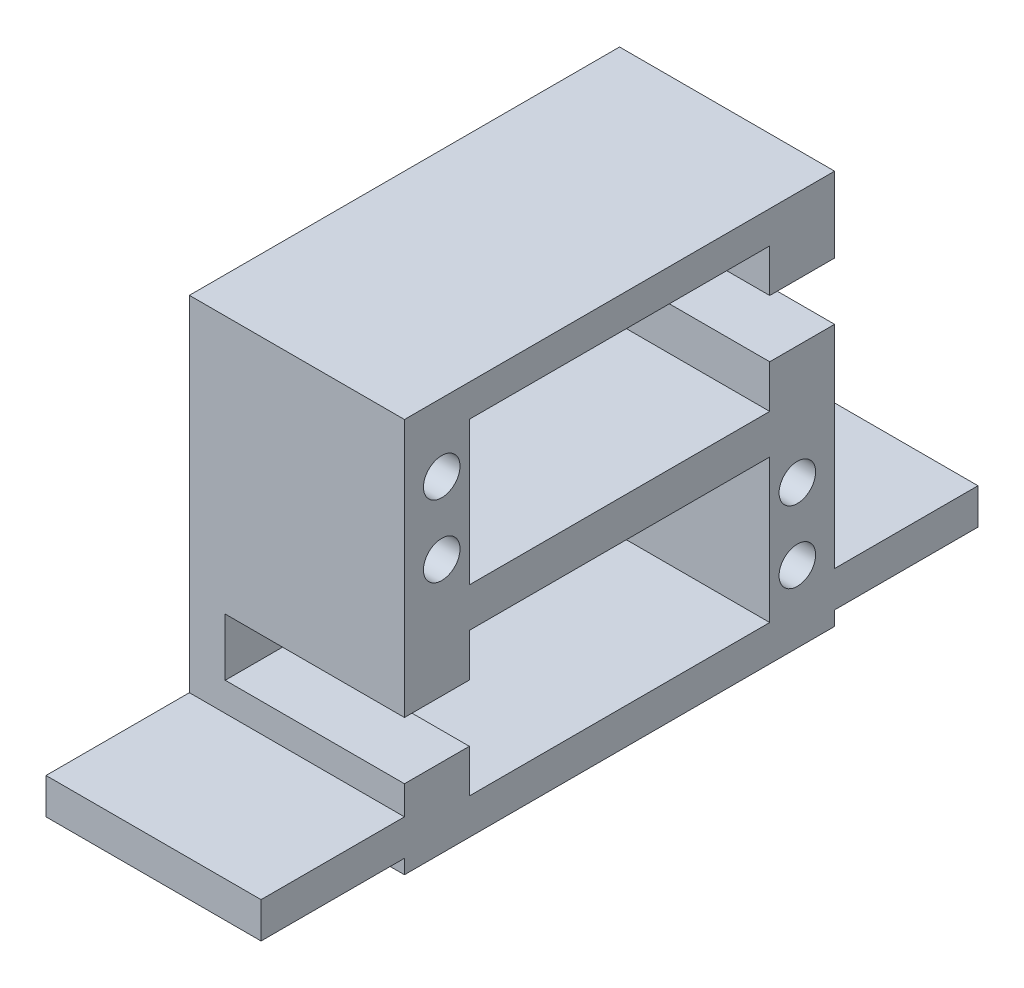
ISO-10303-21;
HEADER;
FILE_DESCRIPTION(('STEP AP214'),'2;1');
FILE_NAME('part.step','',(''),(''),'','','');
FILE_SCHEMA(('AUTOMOTIVE_DESIGN { 1 0 10303 214 1 1 1 1 }'));
ENDSEC;
DATA;
#1=APPLICATION_CONTEXT('core data for automotive mechanical design processes');
#2=APPLICATION_PROTOCOL_DEFINITION('international standard','automotive_design',2000,#1);
#3=PRODUCT_CONTEXT('',#1,'mechanical');
#4=PRODUCT('Part','Part','',(#3));
#5=PRODUCT_RELATED_PRODUCT_CATEGORY('part','',(#4));
#6=PRODUCT_DEFINITION_FORMATION('','',#4);
#7=PRODUCT_DEFINITION_CONTEXT('part definition',#1,'design');
#8=PRODUCT_DEFINITION('design','',#6,#7);
#9=PRODUCT_DEFINITION_SHAPE('','',#8);
#10=(LENGTH_UNIT() NAMED_UNIT(*) SI_UNIT(.MILLI.,.METRE.));
#11=(NAMED_UNIT(*) PLANE_ANGLE_UNIT() SI_UNIT($,.RADIAN.));
#12=(NAMED_UNIT(*) SI_UNIT($,.STERADIAN.) SOLID_ANGLE_UNIT());
#13=UNCERTAINTY_MEASURE_WITH_UNIT(LENGTH_MEASURE(1.E-05),#10,'distance_accuracy_value','');
#14=(GEOMETRIC_REPRESENTATION_CONTEXT(3) GLOBAL_UNCERTAINTY_ASSIGNED_CONTEXT((#13)) GLOBAL_UNIT_ASSIGNED_CONTEXT((#10,
#11,#12)) REPRESENTATION_CONTEXT('',''));
#15=CARTESIAN_POINT('',(0.,0.,0.));
#16=DIRECTION('',(0.,0.,1.));
#17=DIRECTION('',(1.,0.,0.));
#18=AXIS2_PLACEMENT_3D('',#15,#16,#17);
#19=CARTESIAN_POINT('',(4.12598425196847,25.,13.5877952755906));
#20=DIRECTION('',(0.,0.,1.));
#21=DIRECTION('',(0.,-1.,0.));
#22=AXIS2_PLACEMENT_3D('',#19,#20,#21);
#23=PLANE('',#22);
#24=DIRECTION('',(-1.,0.,0.));
#25=VECTOR('',#24,1.);
#26=CARTESIAN_POINT('',(29.1259842519685,5.,13.5877952755906));
#27=LINE('',#26,#25);
#28=CARTESIAN_POINT('',(29.1259842519685,5.,13.5877952755906));
#29=VERTEX_POINT('',#28);
#30=CARTESIAN_POINT('',(4.12598425196847,5.,13.5877952755906));
#31=VERTEX_POINT('',#30);
#32=EDGE_CURVE('E69',#29,#31,#27,.T.);
#33=ORIENTED_EDGE('',*,*,#32,.T.);
#34=DIRECTION('',(0.,-1.,0.));
#35=VECTOR('',#34,1.);
#36=CARTESIAN_POINT('',(4.12598425196847,25.,13.5877952755906));
#37=LINE('',#36,#35);
#38=CARTESIAN_POINT('',(4.12598425196847,11.,13.5877952755906));
#39=VERTEX_POINT('',#38);
#40=EDGE_CURVE('E475',#39,#31,#37,.T.);
#41=ORIENTED_EDGE('',*,*,#40,.F.);
#42=DIRECTION('',(1.,0.,0.));
#43=VECTOR('',#42,1.);
#44=CARTESIAN_POINT('',(4.12598425196847,11.,13.5877952755906));
#45=LINE('',#44,#43);
#46=CARTESIAN_POINT('',(29.1259842519685,11.,13.5877952755906));
#47=VERTEX_POINT('',#46);
#48=EDGE_CURVE('E395',#39,#47,#45,.T.);
#49=ORIENTED_EDGE('',*,*,#48,.T.);
#50=DIRECTION('',(0.,1.,0.));
#51=VECTOR('',#50,1.);
#52=CARTESIAN_POINT('',(29.1259842519685,25.,13.5877952755906));
#53=LINE('',#52,#51);
#54=EDGE_CURVE('E335',#29,#47,#53,.T.);
#55=ORIENTED_EDGE('',*,*,#54,.F.);
#56=EDGE_LOOP('',(#33,#41,#49,#55));
#57=FACE_BOUND('',#56,.T.);
#58=ADVANCED_FACE('F45',(#57),#23,.F.);
#59=CARTESIAN_POINT('',(4.12598425196847,25.,-28.3122047244094));
#60=DIRECTION('',(0.,0.,-1.));
#61=DIRECTION('',(-1.,0.,0.));
#62=AXIS2_PLACEMENT_3D('',#59,#60,#61);
#63=PLANE('',#62);
#64=DIRECTION('',(-1.,0.,0.));
#65=VECTOR('',#64,1.);
#66=CARTESIAN_POINT('',(29.1259842519685,5.,-28.3122047244094));
#67=LINE('',#66,#65);
#68=CARTESIAN_POINT('',(29.1259842519685,5.,-28.3122047244094));
#69=VERTEX_POINT('',#68);
#70=CARTESIAN_POINT('',(4.12598425196847,5.,-28.3122047244094));
#71=VERTEX_POINT('',#70);
#72=EDGE_CURVE('E559',#69,#71,#67,.T.);
#73=ORIENTED_EDGE('',*,*,#72,.F.);
#74=DIRECTION('',(0.,-1.,0.));
#75=VECTOR('',#74,1.);
#76=CARTESIAN_POINT('',(29.1259842519685,25.,-28.3122047244094));
#77=LINE('',#76,#75);
#78=CARTESIAN_POINT('',(29.1259842519685,25.,-28.3122047244094));
#79=VERTEX_POINT('',#78);
#80=EDGE_CURVE('E338',#79,#69,#77,.T.);
#81=ORIENTED_EDGE('',*,*,#80,.F.);
#82=DIRECTION('',(1.,0.,0.));
#83=VECTOR('',#82,1.);
#84=CARTESIAN_POINT('',(4.12598425196847,25.,-28.3122047244094));
#85=LINE('',#84,#83);
#86=CARTESIAN_POINT('',(4.12598425196847,25.,-28.3122047244094));
#87=VERTEX_POINT('',#86);
#88=EDGE_CURVE('E461',#87,#79,#85,.T.);
#89=ORIENTED_EDGE('',*,*,#88,.F.);
#90=DIRECTION('',(0.,1.,0.));
#91=VECTOR('',#90,1.);
#92=CARTESIAN_POINT('',(4.12598425196847,25.,-28.3122047244094));
#93=LINE('',#92,#91);
#94=EDGE_CURVE('E472',#71,#87,#93,.T.);
#95=ORIENTED_EDGE('',*,*,#94,.F.);
#96=EDGE_LOOP('',(#73,#81,#89,#95));
#97=FACE_BOUND('',#96,.T.);
#98=ADVANCED_FACE('F557',(#97),#63,.F.);
#99=CARTESIAN_POINT('',(4.12598425196847,0.,0.));
#100=DIRECTION('',(1.,0.,0.));
#101=DIRECTION('',(0.,0.,-1.));
#102=AXIS2_PLACEMENT_3D('',#99,#100,#101);
#103=PLANE('',#102);
#104=ORIENTED_EDGE('',*,*,#40,.T.);
#105=DIRECTION('',(0.,0.,1.));
#106=VECTOR('',#105,1.);
#107=CARTESIAN_POINT('',(4.12598425196847,5.,13.5877952755906));
#108=LINE('',#107,#106);
#109=EDGE_CURVE('E61',#71,#31,#108,.T.);
#110=ORIENTED_EDGE('',*,*,#109,.F.);
#111=ORIENTED_EDGE('',*,*,#94,.T.);
#112=DIRECTION('',(0.,0.,1.));
#113=VECTOR('',#112,1.);
#114=CARTESIAN_POINT('',(4.12598425196847,25.,13.5877952755906));
#115=LINE('',#114,#113);
#116=CARTESIAN_POINT('',(4.12598425196847,25.,13.5877952755906));
#117=VERTEX_POINT('',#116);
#118=EDGE_CURVE('E465',#87,#117,#115,.T.);
#119=ORIENTED_EDGE('',*,*,#118,.T.);
#120=CARTESIAN_POINT('',(4.12598425196847,19.,13.5877952755906));
#121=VERTEX_POINT('',#120);
#122=EDGE_CURVE('E431',#117,#121,#37,.T.);
#123=ORIENTED_EDGE('',*,*,#122,.T.);
#124=DIRECTION('',(0.,0.,1.));
#125=VECTOR('',#124,1.);
#126=CARTESIAN_POINT('',(4.12598425196847,19.,22.6377952755906));
#127=LINE('',#126,#125);
#128=CARTESIAN_POINT('',(4.12598425196847,19.,22.6377952755906));
#129=VERTEX_POINT('',#128);
#130=EDGE_CURVE('E381',#121,#129,#127,.T.);
#131=ORIENTED_EDGE('',*,*,#130,.T.);
#132=DIRECTION('',(0.,-1.,0.));
#133=VECTOR('',#132,1.);
#134=CARTESIAN_POINT('',(4.12598425196847,19.,22.6377952755906));
#135=LINE('',#134,#133);
#136=CARTESIAN_POINT('',(4.12598425196847,11.,22.6377952755906));
#137=VERTEX_POINT('',#136);
#138=EDGE_CURVE('E373',#129,#137,#135,.T.);
#139=ORIENTED_EDGE('',*,*,#138,.T.);
#140=DIRECTION('',(0.,0.,-1.));
#141=VECTOR('',#140,1.);
#142=CARTESIAN_POINT('',(4.12598425196847,11.,22.6377952755906));
#143=LINE('',#142,#141);
#144=EDGE_CURVE('E377',#137,#39,#143,.T.);
#145=ORIENTED_EDGE('',*,*,#144,.T.);
#146=EDGE_LOOP('',(#104,#110,#111,#119,#123,#131,#139,#145));
#147=FACE_BOUND('',#146,.T.);
#148=ADVANCED_FACE('F539',(#147),#103,.T.);
#149=CARTESIAN_POINT('',(-0.874015748031524,55.,22.6377952755906));
#150=DIRECTION('',(0.,0.,-1.));
#151=DIRECTION('',(-1.,0.,0.));
#152=AXIS2_PLACEMENT_3D('',#149,#150,#151);
#153=PLANE('',#152);
#154=DIRECTION('',(0.,-1.,0.));
#155=VECTOR('',#154,1.);
#156=CARTESIAN_POINT('',(-0.874015748031524,55.,22.6377952755906));
#157=LINE('',#156,#155);
#158=CARTESIAN_POINT('',(-0.874015748031524,55.,22.6377952755906));
#159=VERTEX_POINT('',#158);
#160=CARTESIAN_POINT('',(-0.874015748031524,7.,22.6377952755906));
#161=VERTEX_POINT('',#160);
#162=EDGE_CURVE('E54',#159,#161,#157,.T.);
#163=ORIENTED_EDGE('',*,*,#162,.T.);
#164=DIRECTION('',(1.,0.,0.));
#165=VECTOR('',#164,1.);
#166=CARTESIAN_POINT('',(-0.874015748031524,7.,22.6377952755906));
#167=LINE('',#166,#165);
#168=CARTESIAN_POINT('',(29.1259842519685,7.,22.6377952755906));
#169=VERTEX_POINT('',#168);
#170=EDGE_CURVE('E314',#161,#169,#167,.T.);
#171=ORIENTED_EDGE('',*,*,#170,.T.);
#172=DIRECTION('',(0.,-1.,0.));
#173=VECTOR('',#172,1.);
#174=CARTESIAN_POINT('',(29.1259842519685,55.,22.6377952755906));
#175=LINE('',#174,#173);
#176=CARTESIAN_POINT('',(29.1259842519685,11.,22.6377952755906));
#177=VERTEX_POINT('',#176);
#178=EDGE_CURVE('E323',#177,#169,#175,.T.);
#179=ORIENTED_EDGE('',*,*,#178,.F.);
#180=DIRECTION('',(1.,0.,0.));
#181=VECTOR('',#180,1.);
#182=CARTESIAN_POINT('',(4.12598425196847,11.,22.6377952755906));
#183=LINE('',#182,#181);
#184=EDGE_CURVE('E385',#137,#177,#183,.T.);
#185=ORIENTED_EDGE('',*,*,#184,.F.);
#186=ORIENTED_EDGE('',*,*,#138,.F.);
#187=DIRECTION('',(1.,0.,0.));
#188=VECTOR('',#187,1.);
#189=CARTESIAN_POINT('',(4.12598425196847,19.,22.6377952755906));
#190=LINE('',#189,#188);
#191=CARTESIAN_POINT('',(29.1259842519685,19.,22.6377952755906));
#192=VERTEX_POINT('',#191);
#193=EDGE_CURVE('E386',#129,#192,#190,.T.);
#194=ORIENTED_EDGE('',*,*,#193,.T.);
#195=CARTESIAN_POINT('',(29.1259842519685,55.,22.6377952755906));
#196=VERTEX_POINT('',#195);
#197=EDGE_CURVE('E319',#196,#192,#175,.T.);
#198=ORIENTED_EDGE('',*,*,#197,.F.);
#199=DIRECTION('',(1.,0.,0.));
#200=VECTOR('',#199,1.);
#201=CARTESIAN_POINT('',(-0.874015748031524,55.,22.6377952755906));
#202=LINE('',#201,#200);
#203=EDGE_CURVE('E483',#159,#196,#202,.T.);
#204=ORIENTED_EDGE('',*,*,#203,.F.);
#205=EDGE_LOOP('',(#163,#171,#179,#185,#186,#194,#198,#204));
#206=FACE_BOUND('',#205,.T.);
#207=ADVANCED_FACE('F534',(#206),#153,.F.);
#208=CARTESIAN_POINT('',(-0.874015748031532,55.,-37.3622047244094));
#209=DIRECTION('',(0.,0.,1.));
#210=DIRECTION('',(1.,0.,0.));
#211=AXIS2_PLACEMENT_3D('',#208,#209,#210);
#212=PLANE('',#211);
#213=DIRECTION('',(0.,1.,0.));
#214=VECTOR('',#213,1.);
#215=CARTESIAN_POINT('',(29.1259842519685,55.,-37.3622047244094));
#216=LINE('',#215,#214);
#217=CARTESIAN_POINT('',(29.1259842519685,7.,-37.3622047244094));
#218=VERTEX_POINT('',#217);
#219=CARTESIAN_POINT('',(29.1259842519685,36.5,-37.3622047244094));
#220=VERTEX_POINT('',#219);
#221=EDGE_CURVE('E332',#218,#220,#216,.T.);
#222=ORIENTED_EDGE('',*,*,#221,.F.);
#223=DIRECTION('',(-1.,0.,0.));
#224=VECTOR('',#223,1.);
#225=CARTESIAN_POINT('',(-0.874015748031532,7.,-37.3622047244094));
#226=LINE('',#225,#224);
#227=CARTESIAN_POINT('',(-0.874015748031524,7.,-37.3622047244094));
#228=VERTEX_POINT('',#227);
#229=EDGE_CURVE('E310',#218,#228,#226,.T.);
#230=ORIENTED_EDGE('',*,*,#229,.T.);
#231=DIRECTION('',(0.,-1.,0.));
#232=VECTOR('',#231,1.);
#233=CARTESIAN_POINT('',(-0.874015748031532,55.,-37.3622047244094));
#234=LINE('',#233,#232);
#235=CARTESIAN_POINT('',(-0.874015748031532,55.,-37.3622047244094));
#236=VERTEX_POINT('',#235);
#237=EDGE_CURVE('E501',#236,#228,#234,.T.);
#238=ORIENTED_EDGE('',*,*,#237,.F.);
#239=DIRECTION('',(-1.,0.,0.));
#240=VECTOR('',#239,1.);
#241=CARTESIAN_POINT('',(-0.874015748031532,55.,-37.3622047244094));
#242=LINE('',#241,#240);
#243=CARTESIAN_POINT('',(29.1259842519685,55.,-37.3622047244094));
#244=VERTEX_POINT('',#243);
#245=EDGE_CURVE('E488',#244,#236,#242,.T.);
#246=ORIENTED_EDGE('',*,*,#245,.F.);
#247=CARTESIAN_POINT('',(29.1259842519685,44.5,-37.3622047244094));
#248=VERTEX_POINT('',#247);
#249=EDGE_CURVE('E326',#248,#244,#216,.T.);
#250=ORIENTED_EDGE('',*,*,#249,.F.);
#251=DIRECTION('',(1.,0.,0.));
#252=VECTOR('',#251,1.);
#253=CARTESIAN_POINT('',(4.12598425196847,44.5,-37.3622047244094));
#254=LINE('',#253,#252);
#255=CARTESIAN_POINT('',(4.12598425196847,44.5,-37.3622047244094));
#256=VERTEX_POINT('',#255);
#257=EDGE_CURVE('E411',#256,#248,#254,.T.);
#258=ORIENTED_EDGE('',*,*,#257,.F.);
#259=DIRECTION('',(0.,1.,0.));
#260=VECTOR('',#259,1.);
#261=CARTESIAN_POINT('',(4.12598425196847,44.5,-37.3622047244094));
#262=LINE('',#261,#260);
#263=CARTESIAN_POINT('',(4.12598425196847,36.5,-37.3622047244094));
#264=VERTEX_POINT('',#263);
#265=EDGE_CURVE('E420',#264,#256,#262,.T.);
#266=ORIENTED_EDGE('',*,*,#265,.F.);
#267=DIRECTION('',(1.,0.,0.));
#268=VECTOR('',#267,1.);
#269=CARTESIAN_POINT('',(4.12598425196847,36.5,-37.3622047244094));
#270=LINE('',#269,#268);
#271=EDGE_CURVE('E407',#264,#220,#270,.T.);
#272=ORIENTED_EDGE('',*,*,#271,.T.);
#273=EDGE_LOOP('',(#222,#230,#238,#246,#250,#258,#266,#272));
#274=FACE_BOUND('',#273,.T.);
#275=ADVANCED_FACE('F618',(#274),#212,.F.);
#276=DIRECTION('',(0.,1.,0.));
#277=VECTOR('',#276,1.);
#278=CARTESIAN_POINT('',(29.1259842519685,25.,13.5877952755906));
#279=LINE('',#278,#277);
#280=CARTESIAN_POINT('',(29.1259842519685,19.,13.5877952755906));
#281=VERTEX_POINT('',#280);
#282=CARTESIAN_POINT('',(29.1259842519685,25.,13.5877952755906));
#283=VERTEX_POINT('',#282);
#284=EDGE_CURVE('E345',#281,#283,#279,.T.);
#285=ORIENTED_EDGE('',*,*,#284,.F.);
#286=DIRECTION('',(1.,0.,0.));
#287=VECTOR('',#286,1.);
#288=CARTESIAN_POINT('',(4.12598425196847,19.,13.5877952755906));
#289=LINE('',#288,#287);
#290=EDGE_CURVE('E391',#121,#281,#289,.T.);
#291=ORIENTED_EDGE('',*,*,#290,.F.);
#292=ORIENTED_EDGE('',*,*,#122,.F.);
#293=DIRECTION('',(1.,0.,0.));
#294=VECTOR('',#293,1.);
#295=CARTESIAN_POINT('',(4.12598425196847,25.,13.5877952755906));
#296=LINE('',#295,#294);
#297=EDGE_CURVE('E390',#117,#283,#296,.T.);
#298=ORIENTED_EDGE('',*,*,#297,.T.);
#299=EDGE_LOOP('',(#285,#291,#292,#298));
#300=FACE_BOUND('',#299,.T.);
#301=ADVANCED_FACE('F548',(#300),#23,.F.);
#302=CARTESIAN_POINT('',(4.12598425196847,50.5,-28.3122047244094));
#303=DIRECTION('',(0.,0.,-1.));
#304=DIRECTION('',(-1.,0.,0.));
#305=AXIS2_PLACEMENT_3D('',#302,#303,#304);
#306=PLANE('',#305);
#307=DIRECTION('',(0.,-1.,0.));
#308=VECTOR('',#307,1.);
#309=CARTESIAN_POINT('',(29.1259842519685,50.5,-28.3122047244094));
#310=LINE('',#309,#308);
#311=CARTESIAN_POINT('',(29.1259842519685,50.5,-28.3122047244094));
#312=VERTEX_POINT('',#311);
#313=CARTESIAN_POINT('',(29.1259842519685,44.5,-28.3122047244094));
#314=VERTEX_POINT('',#313);
#315=EDGE_CURVE('E366',#312,#314,#310,.T.);
#316=ORIENTED_EDGE('',*,*,#315,.F.);
#317=DIRECTION('',(1.,0.,0.));
#318=VECTOR('',#317,1.);
#319=CARTESIAN_POINT('',(4.12598425196847,50.5,-28.3122047244094));
#320=LINE('',#319,#318);
#321=CARTESIAN_POINT('',(4.12598425196847,50.5,-28.3122047244094));
#322=VERTEX_POINT('',#321);
#323=EDGE_CURVE('E450',#322,#312,#320,.T.);
#324=ORIENTED_EDGE('',*,*,#323,.F.);
#325=DIRECTION('',(0.,1.,0.));
#326=VECTOR('',#325,1.);
#327=CARTESIAN_POINT('',(4.12598425196847,50.5,-28.3122047244094));
#328=LINE('',#327,#326);
#329=CARTESIAN_POINT('',(4.12598425196847,44.5,-28.3122047244094));
#330=VERTEX_POINT('',#329);
#331=EDGE_CURVE('E435',#330,#322,#328,.T.);
#332=ORIENTED_EDGE('',*,*,#331,.F.);
#333=DIRECTION('',(1.,0.,0.));
#334=VECTOR('',#333,1.);
#335=CARTESIAN_POINT('',(4.12598425196847,44.5,-28.3122047244094));
#336=LINE('',#335,#334);
#337=EDGE_CURVE('E372',#330,#314,#336,.T.);
#338=ORIENTED_EDGE('',*,*,#337,.T.);
#339=EDGE_LOOP('',(#316,#324,#332,#338));
#340=FACE_BOUND('',#339,.T.);
#341=ADVANCED_FACE('F617',(#340),#306,.F.);
#342=CARTESIAN_POINT('',(29.1259842519685,2.,22.6377952755906));
#343=VERTEX_POINT('',#342);
#344=CARTESIAN_POINT('',(29.1259842519685,0.,22.6377952755906));
#345=VERTEX_POINT('',#344);
#346=EDGE_CURVE('E318',#343,#345,#175,.T.);
#347=ORIENTED_EDGE('',*,*,#346,.F.);
#348=DIRECTION('',(-1.,0.,0.));
#349=VECTOR('',#348,1.);
#350=CARTESIAN_POINT('',(-0.874015748031524,2.,22.6377952755906));
#351=LINE('',#350,#349);
#352=CARTESIAN_POINT('',(-0.874015748031524,2.,22.6377952755906));
#353=VERTEX_POINT('',#352);
#354=EDGE_CURVE('E307',#343,#353,#351,.T.);
#355=ORIENTED_EDGE('',*,*,#354,.T.);
#356=CARTESIAN_POINT('',(-0.874015748031524,0.,22.6377952755906));
#357=VERTEX_POINT('',#356);
#358=EDGE_CURVE('E237',#353,#357,#157,.T.);
#359=ORIENTED_EDGE('',*,*,#358,.T.);
#360=DIRECTION('',(1.,0.,0.));
#361=VECTOR('',#360,1.);
#362=CARTESIAN_POINT('',(-0.874015748031524,0.,22.6377952755906));
#363=LINE('',#362,#361);
#364=EDGE_CURVE('E494',#357,#345,#363,.T.);
#365=ORIENTED_EDGE('',*,*,#364,.T.);
#366=EDGE_LOOP('',(#347,#355,#359,#365));
#367=FACE_BOUND('',#366,.T.);
#368=ADVANCED_FACE('F512',(#367),#153,.F.);
#369=CARTESIAN_POINT('',(-0.874015748031524,2.,-37.3622047244094));
#370=VERTEX_POINT('',#369);
#371=CARTESIAN_POINT('',(-0.874015748031532,0.,-37.3622047244094));
#372=VERTEX_POINT('',#371);
#373=EDGE_CURVE('E491',#370,#372,#234,.T.);
#374=ORIENTED_EDGE('',*,*,#373,.F.);
#375=DIRECTION('',(1.,0.,0.));
#376=VECTOR('',#375,1.);
#377=CARTESIAN_POINT('',(-0.874015748031532,2.,-37.3622047244094));
#378=LINE('',#377,#376);
#379=CARTESIAN_POINT('',(29.1259842519685,2.,-37.3622047244094));
#380=VERTEX_POINT('',#379);
#381=EDGE_CURVE('E292',#370,#380,#378,.T.);
#382=ORIENTED_EDGE('',*,*,#381,.T.);
#383=CARTESIAN_POINT('',(29.1259842519685,0.,-37.3622047244094));
#384=VERTEX_POINT('',#383);
#385=EDGE_CURVE('E327',#384,#380,#216,.T.);
#386=ORIENTED_EDGE('',*,*,#385,.F.);
#387=DIRECTION('',(-1.,0.,0.));
#388=VECTOR('',#387,1.);
#389=CARTESIAN_POINT('',(-0.874015748031532,0.,-37.3622047244094));
#390=LINE('',#389,#388);
#391=EDGE_CURVE('E484',#384,#372,#390,.T.);
#392=ORIENTED_EDGE('',*,*,#391,.T.);
#393=EDGE_LOOP('',(#374,#382,#386,#392));
#394=FACE_BOUND('',#393,.T.);
#395=ADVANCED_FACE('F522',(#394),#212,.F.);
#396=CARTESIAN_POINT('',(0.,55.,0.));
#397=DIRECTION('',(0.,1.,0.));
#398=DIRECTION('',(0.,0.,1.));
#399=AXIS2_PLACEMENT_3D('',#396,#397,#398);
#400=PLANE('',#399);
#401=ORIENTED_EDGE('',*,*,#203,.T.);
#402=DIRECTION('',(0.,0.,1.));
#403=VECTOR('',#402,1.);
#404=CARTESIAN_POINT('',(29.1259842519685,55.,22.6377952755906));
#405=LINE('',#404,#403);
#406=EDGE_CURVE('E331',#244,#196,#405,.T.);
#407=ORIENTED_EDGE('',*,*,#406,.F.);
#408=ORIENTED_EDGE('',*,*,#245,.T.);
#409=DIRECTION('',(0.,0.,1.));
#410=VECTOR('',#409,1.);
#411=CARTESIAN_POINT('',(-0.874015748031532,55.,-37.3622047244094));
#412=LINE('',#411,#410);
#413=EDGE_CURVE('E479',#236,#159,#412,.T.);
#414=ORIENTED_EDGE('',*,*,#413,.T.);
#415=EDGE_LOOP('',(#401,#407,#408,#414));
#416=FACE_BOUND('',#415,.T.);
#417=ADVANCED_FACE('F636',(#416),#400,.T.);
#418=CARTESIAN_POINT('',(0.,0.,0.));
#419=DIRECTION('',(0.,1.,0.));
#420=DIRECTION('',(0.,0.,1.));
#421=AXIS2_PLACEMENT_3D('',#418,#419,#420);
#422=PLANE('',#421);
#423=DIRECTION('',(0.,0.,-1.));
#424=VECTOR('',#423,1.);
#425=CARTESIAN_POINT('',(29.1259842519685,0.,22.6377952755906));
#426=LINE('',#425,#424);
#427=EDGE_CURVE('E322',#345,#384,#426,.T.);
#428=ORIENTED_EDGE('',*,*,#427,.F.);
#429=ORIENTED_EDGE('',*,*,#364,.F.);
#430=DIRECTION('',(0.,0.,1.));
#431=VECTOR('',#430,1.);
#432=CARTESIAN_POINT('',(-0.874015748031532,0.,-37.3622047244094));
#433=LINE('',#432,#431);
#434=EDGE_CURVE('E449',#372,#357,#433,.T.);
#435=ORIENTED_EDGE('',*,*,#434,.F.);
#436=ORIENTED_EDGE('',*,*,#391,.F.);
#437=EDGE_LOOP('',(#428,#429,#435,#436));
#438=FACE_BOUND('',#437,.T.);
#439=ADVANCED_FACE('F516',(#438),#422,.F.);
#440=CARTESIAN_POINT('',(4.12598425196847,25.,13.5877952755906));
#441=DIRECTION('',(0.,1.,0.));
#442=DIRECTION('',(0.,0.,1.));
#443=AXIS2_PLACEMENT_3D('',#440,#441,#442);
#444=PLANE('',#443);
#445=DIRECTION('',(0.,0.,-1.));
#446=VECTOR('',#445,1.);
#447=CARTESIAN_POINT('',(29.1259842519685,25.,13.5877952755906));
#448=LINE('',#447,#446);
#449=EDGE_CURVE('E342',#283,#79,#448,.T.);
#450=ORIENTED_EDGE('',*,*,#449,.F.);
#451=ORIENTED_EDGE('',*,*,#297,.F.);
#452=ORIENTED_EDGE('',*,*,#118,.F.);
#453=ORIENTED_EDGE('',*,*,#88,.T.);
#454=EDGE_LOOP('',(#450,#451,#452,#453));
#455=FACE_BOUND('',#454,.T.);
#456=ADVANCED_FACE('F552',(#455),#444,.F.);
#457=CARTESIAN_POINT('',(4.12598425196847,50.5,13.5877952755906));
#458=DIRECTION('',(0.,0.,1.));
#459=DIRECTION('',(0.,-1.,0.));
#460=AXIS2_PLACEMENT_3D('',#457,#458,#459);
#461=PLANE('',#460);
#462=DIRECTION('',(0.,1.,0.));
#463=VECTOR('',#462,1.);
#464=CARTESIAN_POINT('',(29.1259842519685,50.5,13.5877952755906));
#465=LINE('',#464,#463);
#466=CARTESIAN_POINT('',(29.1259842519685,30.5,13.5877952755906));
#467=VERTEX_POINT('',#466);
#468=CARTESIAN_POINT('',(29.1259842519685,50.5,13.5877952755906));
#469=VERTEX_POINT('',#468);
#470=EDGE_CURVE('E360',#467,#469,#465,.T.);
#471=ORIENTED_EDGE('',*,*,#470,.F.);
#472=DIRECTION('',(1.,0.,0.));
#473=VECTOR('',#472,1.);
#474=CARTESIAN_POINT('',(4.12598425196847,30.5,13.5877952755906));
#475=LINE('',#474,#473);
#476=CARTESIAN_POINT('',(4.12598425196847,30.5,13.5877952755906));
#477=VERTEX_POINT('',#476);
#478=EDGE_CURVE('E444',#477,#467,#475,.T.);
#479=ORIENTED_EDGE('',*,*,#478,.F.);
#480=DIRECTION('',(0.,-1.,0.));
#481=VECTOR('',#480,1.);
#482=CARTESIAN_POINT('',(4.12598425196847,50.5,13.5877952755906));
#483=LINE('',#482,#481);
#484=CARTESIAN_POINT('',(4.12598425196847,50.5,13.5877952755906));
#485=VERTEX_POINT('',#484);
#486=EDGE_CURVE('E426',#485,#477,#483,.T.);
#487=ORIENTED_EDGE('',*,*,#486,.F.);
#488=DIRECTION('',(1.,0.,0.));
#489=VECTOR('',#488,1.);
#490=CARTESIAN_POINT('',(4.12598425196847,50.5,13.5877952755906));
#491=LINE('',#490,#489);
#492=EDGE_CURVE('E445',#485,#469,#491,.T.);
#493=ORIENTED_EDGE('',*,*,#492,.T.);
#494=EDGE_LOOP('',(#471,#479,#487,#493));
#495=FACE_BOUND('',#494,.T.);
#496=ADVANCED_FACE('F883',(#495),#461,.F.);
#497=CARTESIAN_POINT('',(4.12598425196847,50.5,13.5877952755906));
#498=DIRECTION('',(0.,1.,0.));
#499=DIRECTION('',(0.,0.,1.));
#500=AXIS2_PLACEMENT_3D('',#497,#498,#499);
#501=PLANE('',#500);
#502=DIRECTION('',(0.,0.,-1.));
#503=VECTOR('',#502,1.);
#504=CARTESIAN_POINT('',(29.1259842519685,50.5,13.5877952755906));
#505=LINE('',#504,#503);
#506=EDGE_CURVE('E363',#469,#312,#505,.T.);
#507=ORIENTED_EDGE('',*,*,#506,.F.);
#508=ORIENTED_EDGE('',*,*,#492,.F.);
#509=DIRECTION('',(0.,0.,1.));
#510=VECTOR('',#509,1.);
#511=CARTESIAN_POINT('',(4.12598425196847,50.5,13.5877952755906));
#512=LINE('',#511,#510);
#513=EDGE_CURVE('E440',#322,#485,#512,.T.);
#514=ORIENTED_EDGE('',*,*,#513,.F.);
#515=ORIENTED_EDGE('',*,*,#323,.T.);
#516=EDGE_LOOP('',(#507,#508,#514,#515));
#517=FACE_BOUND('',#516,.T.);
#518=ADVANCED_FACE('F887',(#517),#501,.F.);
#519=DIRECTION('',(0.,-1.,0.));
#520=VECTOR('',#519,1.);
#521=CARTESIAN_POINT('',(29.1259842519685,50.5,-28.3122047244094));
#522=LINE('',#521,#520);
#523=CARTESIAN_POINT('',(29.1259842519685,36.5,-28.3122047244094));
#524=VERTEX_POINT('',#523);
#525=CARTESIAN_POINT('',(29.1259842519685,30.5,-28.3122047244094));
#526=VERTEX_POINT('',#525);
#527=EDGE_CURVE('E354',#524,#526,#522,.T.);
#528=ORIENTED_EDGE('',*,*,#527,.F.);
#529=DIRECTION('',(1.,0.,0.));
#530=VECTOR('',#529,1.);
#531=CARTESIAN_POINT('',(4.12598425196847,36.5,-28.3122047244094));
#532=LINE('',#531,#530);
#533=CARTESIAN_POINT('',(4.12598425196847,36.5,-28.3122047244094));
#534=VERTEX_POINT('',#533);
#535=EDGE_CURVE('E402',#534,#524,#532,.T.);
#536=ORIENTED_EDGE('',*,*,#535,.F.);
#537=CARTESIAN_POINT('',(4.12598425196847,30.5,-28.3122047244094));
#538=VERTEX_POINT('',#537);
#539=EDGE_CURVE('E436',#538,#534,#328,.T.);
#540=ORIENTED_EDGE('',*,*,#539,.F.);
#541=DIRECTION('',(1.,0.,0.));
#542=VECTOR('',#541,1.);
#543=CARTESIAN_POINT('',(4.12598425196847,30.5,-28.3122047244094));
#544=LINE('',#543,#542);
#545=EDGE_CURVE('E454',#538,#526,#544,.T.);
#546=ORIENTED_EDGE('',*,*,#545,.T.);
#547=EDGE_LOOP('',(#528,#536,#540,#546));
#548=FACE_BOUND('',#547,.T.);
#549=ADVANCED_FACE('F625',(#548),#306,.F.);
#550=CARTESIAN_POINT('',(4.12598425196847,30.5,13.5877952755906));
#551=DIRECTION('',(0.,-1.,0.));
#552=DIRECTION('',(0.,0.,-1.));
#553=AXIS2_PLACEMENT_3D('',#550,#551,#552);
#554=PLANE('',#553);
#555=DIRECTION('',(0.,0.,1.));
#556=VECTOR('',#555,1.);
#557=CARTESIAN_POINT('',(29.1259842519685,30.5,13.5877952755906));
#558=LINE('',#557,#556);
#559=EDGE_CURVE('E357',#526,#467,#558,.T.);
#560=ORIENTED_EDGE('',*,*,#559,.F.);
#561=ORIENTED_EDGE('',*,*,#545,.F.);
#562=DIRECTION('',(0.,0.,-1.));
#563=VECTOR('',#562,1.);
#564=CARTESIAN_POINT('',(4.12598425196847,30.5,13.5877952755906));
#565=LINE('',#564,#563);
#566=EDGE_CURVE('E430',#477,#538,#565,.T.);
#567=ORIENTED_EDGE('',*,*,#566,.F.);
#568=ORIENTED_EDGE('',*,*,#478,.T.);
#569=EDGE_LOOP('',(#560,#561,#567,#568));
#570=FACE_BOUND('',#569,.T.);
#571=ADVANCED_FACE('F880',(#570),#554,.F.);
#572=CARTESIAN_POINT('',(4.12598425196847,44.5,-28.3122047244094));
#573=DIRECTION('',(0.,1.,0.));
#574=DIRECTION('',(0.,0.,1.));
#575=AXIS2_PLACEMENT_3D('',#572,#573,#574);
#576=PLANE('',#575);
#577=DIRECTION('',(0.,0.,-1.));
#578=VECTOR('',#577,1.);
#579=CARTESIAN_POINT('',(29.1259842519685,44.5,-28.3122047244094));
#580=LINE('',#579,#578);
#581=EDGE_CURVE('E369',#314,#248,#580,.T.);
#582=ORIENTED_EDGE('',*,*,#581,.F.);
#583=ORIENTED_EDGE('',*,*,#337,.F.);
#584=DIRECTION('',(0.,0.,1.));
#585=VECTOR('',#584,1.);
#586=CARTESIAN_POINT('',(4.12598425196847,44.5,-28.3122047244094));
#587=LINE('',#586,#585);
#588=EDGE_CURVE('E406',#256,#330,#587,.T.);
#589=ORIENTED_EDGE('',*,*,#588,.F.);
#590=ORIENTED_EDGE('',*,*,#257,.T.);
#591=EDGE_LOOP('',(#582,#583,#589,#590));
#592=FACE_BOUND('',#591,.T.);
#593=ADVANCED_FACE('F893',(#592),#576,.F.);
#594=CARTESIAN_POINT('',(4.12598425196847,36.5,-28.3122047244094));
#595=DIRECTION('',(0.,-1.,0.));
#596=DIRECTION('',(0.,0.,-1.));
#597=AXIS2_PLACEMENT_3D('',#594,#595,#596);
#598=PLANE('',#597);
#599=DIRECTION('',(0.,0.,1.));
#600=VECTOR('',#599,1.);
#601=CARTESIAN_POINT('',(29.1259842519685,36.5,-28.3122047244094));
#602=LINE('',#601,#600);
#603=EDGE_CURVE('E351',#220,#524,#602,.T.);
#604=ORIENTED_EDGE('',*,*,#603,.F.);
#605=ORIENTED_EDGE('',*,*,#271,.F.);
#606=DIRECTION('',(0.,0.,-1.));
#607=VECTOR('',#606,1.);
#608=CARTESIAN_POINT('',(4.12598425196847,36.5,-28.3122047244094));
#609=LINE('',#608,#607);
#610=EDGE_CURVE('E378',#534,#264,#609,.T.);
#611=ORIENTED_EDGE('',*,*,#610,.F.);
#612=ORIENTED_EDGE('',*,*,#535,.T.);
#613=EDGE_LOOP('',(#604,#605,#611,#612));
#614=FACE_BOUND('',#613,.T.);
#615=ADVANCED_FACE('F869',(#614),#598,.F.);
#616=CARTESIAN_POINT('',(4.12598425196847,19.,22.6377952755906));
#617=DIRECTION('',(0.,1.,0.));
#618=DIRECTION('',(0.,0.,1.));
#619=AXIS2_PLACEMENT_3D('',#616,#617,#618);
#620=PLANE('',#619);
#621=DIRECTION('',(0.,0.,-1.));
#622=VECTOR('',#621,1.);
#623=CARTESIAN_POINT('',(29.1259842519685,19.,22.6377952755906));
#624=LINE('',#623,#622);
#625=EDGE_CURVE('E348',#192,#281,#624,.T.);
#626=ORIENTED_EDGE('',*,*,#625,.F.);
#627=ORIENTED_EDGE('',*,*,#193,.F.);
#628=ORIENTED_EDGE('',*,*,#130,.F.);
#629=ORIENTED_EDGE('',*,*,#290,.T.);
#630=EDGE_LOOP('',(#626,#627,#628,#629));
#631=FACE_BOUND('',#630,.T.);
#632=ADVANCED_FACE('F543',(#631),#620,.F.);
#633=CARTESIAN_POINT('',(4.12598425196847,11.,22.6377952755906));
#634=DIRECTION('',(0.,-1.,0.));
#635=DIRECTION('',(0.,0.,-1.));
#636=AXIS2_PLACEMENT_3D('',#633,#634,#635);
#637=PLANE('',#636);
#638=DIRECTION('',(0.,0.,1.));
#639=VECTOR('',#638,1.);
#640=CARTESIAN_POINT('',(29.1259842519685,11.,22.6377952755906));
#641=LINE('',#640,#639);
#642=EDGE_CURVE('E11',#47,#177,#641,.T.);
#643=ORIENTED_EDGE('',*,*,#642,.F.);
#644=ORIENTED_EDGE('',*,*,#48,.F.);
#645=ORIENTED_EDGE('',*,*,#144,.F.);
#646=ORIENTED_EDGE('',*,*,#184,.T.);
#647=EDGE_LOOP('',(#643,#644,#645,#646));
#648=FACE_BOUND('',#647,.T.);
#649=ADVANCED_FACE('F537',(#648),#637,.F.);
#650=CARTESIAN_POINT('',(-0.874015748031532,55.,-37.3622047244094));
#651=DIRECTION('',(1.,0.,0.));
#652=DIRECTION('',(0.,0.,-1.));
#653=AXIS2_PLACEMENT_3D('',#650,#651,#652);
#654=PLANE('',#653);
#655=ORIENTED_EDGE('',*,*,#358,.F.);
#656=DIRECTION('',(0.,0.,1.));
#657=VECTOR('',#656,1.);
#658=CARTESIAN_POINT('',(-0.874015748031524,2.,-57.3622047244094));
#659=LINE('',#658,#657);
#660=CARTESIAN_POINT('',(-0.874015748031524,2.,42.6377952755906));
#661=VERTEX_POINT('',#660);
#662=EDGE_CURVE('E231',#353,#661,#659,.T.);
#663=ORIENTED_EDGE('',*,*,#662,.T.);
#664=DIRECTION('',(0.,-1.,0.));
#665=VECTOR('',#664,1.);
#666=CARTESIAN_POINT('',(-0.874015748031524,7.,42.6377952755906));
#667=LINE('',#666,#665);
#668=CARTESIAN_POINT('',(-0.874015748031524,7.,42.6377952755906));
#669=VERTEX_POINT('',#668);
#670=EDGE_CURVE('E235',#669,#661,#667,.T.);
#671=ORIENTED_EDGE('',*,*,#670,.F.);
#672=DIRECTION('',(0.,0.,1.));
#673=VECTOR('',#672,1.);
#674=CARTESIAN_POINT('',(-0.874015748031524,7.,-57.3622047244094));
#675=LINE('',#674,#673);
#676=EDGE_CURVE('E293',#161,#669,#675,.T.);
#677=ORIENTED_EDGE('',*,*,#676,.F.);
#678=ORIENTED_EDGE('',*,*,#162,.F.);
#679=ORIENTED_EDGE('',*,*,#413,.F.);
#680=ORIENTED_EDGE('',*,*,#237,.T.);
#681=CARTESIAN_POINT('',(-0.874015748031524,7.,-57.3622047244094));
#682=VERTEX_POINT('',#681);
#683=EDGE_CURVE('E289',#682,#228,#675,.T.);
#684=ORIENTED_EDGE('',*,*,#683,.F.);
#685=DIRECTION('',(0.,-1.,0.));
#686=VECTOR('',#685,1.);
#687=CARTESIAN_POINT('',(-0.874015748031524,7.,-57.3622047244094));
#688=LINE('',#687,#686);
#689=CARTESIAN_POINT('',(-0.874015748031524,2.,-57.3622047244094));
#690=VERTEX_POINT('',#689);
#691=EDGE_CURVE('E274',#682,#690,#688,.T.);
#692=ORIENTED_EDGE('',*,*,#691,.T.);
#693=EDGE_CURVE('E241',#690,#370,#659,.T.);
#694=ORIENTED_EDGE('',*,*,#693,.T.);
#695=ORIENTED_EDGE('',*,*,#373,.T.);
#696=ORIENTED_EDGE('',*,*,#434,.T.);
#697=EDGE_LOOP('',(#655,#663,#671,#677,#678,#679,#680,#684,#692,#694,#695,#696));
#698=FACE_BOUND('',#697,.T.);
#699=ADVANCED_FACE('F47',(#698),#654,.F.);
#700=CARTESIAN_POINT('',(4.12598425196847,0.,0.));
#701=DIRECTION('',(1.,0.,0.));
#702=DIRECTION('',(0.,0.,-1.));
#703=AXIS2_PLACEMENT_3D('',#700,#701,#702);
#704=PLANE('',#703);
#705=ORIENTED_EDGE('',*,*,#486,.T.);
#706=ORIENTED_EDGE('',*,*,#566,.T.);
#707=ORIENTED_EDGE('',*,*,#539,.T.);
#708=ORIENTED_EDGE('',*,*,#610,.T.);
#709=ORIENTED_EDGE('',*,*,#265,.T.);
#710=ORIENTED_EDGE('',*,*,#588,.T.);
#711=ORIENTED_EDGE('',*,*,#331,.T.);
#712=ORIENTED_EDGE('',*,*,#513,.T.);
#713=EDGE_LOOP('',(#705,#706,#707,#708,#709,#710,#711,#712));
#714=FACE_BOUND('',#713,.T.);
#715=ADVANCED_FACE('F671',(#714),#704,.T.);
#716=CARTESIAN_POINT('',(29.1259842519685,0.,0.));
#717=DIRECTION('',(1.,0.,0.));
#718=DIRECTION('',(0.,0.,-1.));
#719=AXIS2_PLACEMENT_3D('',#716,#717,#718);
#720=PLANE('',#719);
#721=DIRECTION('',(0.,0.,1.));
#722=VECTOR('',#721,1.);
#723=CARTESIAN_POINT('',(29.1259842519685,5.,13.5877952755906));
#724=LINE('',#723,#722);
#725=EDGE_CURVE('E569',#69,#29,#724,.T.);
#726=ORIENTED_EDGE('',*,*,#725,.T.);
#727=ORIENTED_EDGE('',*,*,#54,.T.);
#728=ORIENTED_EDGE('',*,*,#642,.T.);
#729=ORIENTED_EDGE('',*,*,#178,.T.);
#730=DIRECTION('',(0.,0.,1.));
#731=VECTOR('',#730,1.);
#732=CARTESIAN_POINT('',(29.1259842519685,7.,-57.3622047244094));
#733=LINE('',#732,#731);
#734=CARTESIAN_POINT('',(29.1259842519685,7.,42.6377952755906));
#735=VERTEX_POINT('',#734);
#736=EDGE_CURVE('E298',#169,#735,#733,.T.);
#737=ORIENTED_EDGE('',*,*,#736,.T.);
#738=DIRECTION('',(0.,1.,0.));
#739=VECTOR('',#738,1.);
#740=CARTESIAN_POINT('',(29.1259842519685,7.,42.6377952755906));
#741=LINE('',#740,#739);
#742=CARTESIAN_POINT('',(29.1259842519685,2.,42.6377952755906));
#743=VERTEX_POINT('',#742);
#744=EDGE_CURVE('E253',#743,#735,#741,.T.);
#745=ORIENTED_EDGE('',*,*,#744,.F.);
#746=DIRECTION('',(0.,0.,1.));
#747=VECTOR('',#746,1.);
#748=CARTESIAN_POINT('',(29.1259842519685,2.,-57.3622047244094));
#749=LINE('',#748,#747);
#750=EDGE_CURVE('E248',#343,#743,#749,.T.);
#751=ORIENTED_EDGE('',*,*,#750,.F.);
#752=ORIENTED_EDGE('',*,*,#346,.T.);
#753=ORIENTED_EDGE('',*,*,#427,.T.);
#754=ORIENTED_EDGE('',*,*,#385,.T.);
#755=CARTESIAN_POINT('',(29.1259842519685,2.,-57.3622047244094));
#756=VERTEX_POINT('',#755);
#757=EDGE_CURVE('E299',#756,#380,#749,.T.);
#758=ORIENTED_EDGE('',*,*,#757,.F.);
#759=DIRECTION('',(0.,1.,0.));
#760=VECTOR('',#759,1.);
#761=CARTESIAN_POINT('',(29.1259842519685,7.,-57.3622047244094));
#762=LINE('',#761,#760);
#763=CARTESIAN_POINT('',(29.1259842519685,7.,-57.3622047244094));
#764=VERTEX_POINT('',#763);
#765=EDGE_CURVE('E282',#756,#764,#762,.T.);
#766=ORIENTED_EDGE('',*,*,#765,.T.);
#767=EDGE_CURVE('E294',#764,#218,#733,.T.);
#768=ORIENTED_EDGE('',*,*,#767,.T.);
#769=ORIENTED_EDGE('',*,*,#221,.T.);
#770=ORIENTED_EDGE('',*,*,#603,.T.);
#771=ORIENTED_EDGE('',*,*,#527,.T.);
#772=ORIENTED_EDGE('',*,*,#559,.T.);
#773=ORIENTED_EDGE('',*,*,#470,.T.);
#774=ORIENTED_EDGE('',*,*,#506,.T.);
#775=ORIENTED_EDGE('',*,*,#315,.T.);
#776=ORIENTED_EDGE('',*,*,#581,.T.);
#777=ORIENTED_EDGE('',*,*,#249,.T.);
#778=ORIENTED_EDGE('',*,*,#406,.T.);
#779=ORIENTED_EDGE('',*,*,#197,.T.);
#780=ORIENTED_EDGE('',*,*,#625,.T.);
#781=ORIENTED_EDGE('',*,*,#284,.T.);
#782=ORIENTED_EDGE('',*,*,#449,.T.);
#783=ORIENTED_EDGE('',*,*,#80,.T.);
#784=EDGE_LOOP('',(#726,#727,#728,#729,#737,#745,#751,#752,#753,#754,#758,#766,#768,#769,#770,
#771,#772,#773,#774,#775,#776,#777,#778,#779,#780,#781,#782,#783));
#785=FACE_BOUND('',#784,.T.);
#786=CARTESIAN_POINT('',(29.1259842519685,20.,-32.1622047244094));
#787=DIRECTION('',(1.,0.,0.));
#788=DIRECTION('',(0.,0.,-1.));
#789=AXIS2_PLACEMENT_3D('',#786,#787,#788);
#790=CIRCLE('',#789,2.55);
#791=CARTESIAN_POINT('',(29.1259842519685,20.,-34.7122047244094));
#792=VERTEX_POINT('',#791);
#793=EDGE_CURVE('E577',#792,#792,#790,.T.);
#794=ORIENTED_EDGE('',*,*,#793,.F.);
#795=EDGE_LOOP('',(#794));
#796=FACE_BOUND('',#795,.T.);
#797=CARTESIAN_POINT('',(29.1259842519685,10.,-32.1622047244094));
#798=DIRECTION('',(1.,0.,0.));
#799=DIRECTION('',(0.,0.,-1.));
#800=AXIS2_PLACEMENT_3D('',#797,#798,#799);
#801=CIRCLE('',#800,2.55);
#802=CARTESIAN_POINT('',(29.1259842519685,10.,-34.7122047244094));
#803=VERTEX_POINT('',#802);
#804=EDGE_CURVE('E567',#803,#803,#801,.T.);
#805=ORIENTED_EDGE('',*,*,#804,.F.);
#806=EDGE_LOOP('',(#805));
#807=FACE_BOUND('',#806,.T.);
#808=CARTESIAN_POINT('',(29.1259842519685,45.5,17.4377952755906));
#809=DIRECTION('',(1.,0.,0.));
#810=DIRECTION('',(0.,0.,-1.));
#811=AXIS2_PLACEMENT_3D('',#808,#809,#810);
#812=CIRCLE('',#811,2.55);
#813=CARTESIAN_POINT('',(29.1259842519685,45.5,14.8877952755906));
#814=VERTEX_POINT('',#813);
#815=EDGE_CURVE('E264',#814,#814,#812,.T.);
#816=ORIENTED_EDGE('',*,*,#815,.F.);
#817=EDGE_LOOP('',(#816));
#818=FACE_BOUND('',#817,.T.);
#819=CARTESIAN_POINT('',(29.1259842519685,35.5,17.4377952755906));
#820=DIRECTION('',(1.,0.,0.));
#821=DIRECTION('',(0.,0.,-1.));
#822=AXIS2_PLACEMENT_3D('',#819,#820,#821);
#823=CIRCLE('',#822,2.55);
#824=CARTESIAN_POINT('',(29.1259842519685,35.5,14.8877952755906));
#825=VERTEX_POINT('',#824);
#826=EDGE_CURVE('E586',#825,#825,#823,.T.);
#827=ORIENTED_EDGE('',*,*,#826,.F.);
#828=EDGE_LOOP('',(#827));
#829=FACE_BOUND('',#828,.T.);
#830=ADVANCED_FACE('F525',(#785,#796,#807,#818,#829),#720,.T.);
#831=CARTESIAN_POINT('',(0.,0.,-57.3622047244094));
#832=DIRECTION('',(0.,0.,1.));
#833=DIRECTION('',(1.,0.,0.));
#834=AXIS2_PLACEMENT_3D('',#831,#832,#833);
#835=PLANE('',#834);
#836=ORIENTED_EDGE('',*,*,#691,.F.);
#837=DIRECTION('',(-1.,0.,0.));
#838=VECTOR('',#837,1.);
#839=CARTESIAN_POINT('',(-0.874015748031524,7.,-57.3622047244094));
#840=LINE('',#839,#838);
#841=EDGE_CURVE('E242',#764,#682,#840,.T.);
#842=ORIENTED_EDGE('',*,*,#841,.F.);
#843=ORIENTED_EDGE('',*,*,#765,.F.);
#844=DIRECTION('',(1.,0.,0.));
#845=VECTOR('',#844,1.);
#846=CARTESIAN_POINT('',(-0.874015748031524,2.,-57.3622047244094));
#847=LINE('',#846,#845);
#848=EDGE_CURVE('E278',#690,#756,#847,.T.);
#849=ORIENTED_EDGE('',*,*,#848,.F.);
#850=EDGE_LOOP('',(#836,#842,#843,#849));
#851=FACE_BOUND('',#850,.T.);
#852=ADVANCED_FACE('F670',(#851),#835,.F.);
#853=CARTESIAN_POINT('',(-0.874015748031524,2.,-57.3622047244094));
#854=DIRECTION('',(0.,-1.,0.));
#855=DIRECTION('',(0.,0.,-1.));
#856=AXIS2_PLACEMENT_3D('',#853,#854,#855);
#857=PLANE('',#856);
#858=ORIENTED_EDGE('',*,*,#381,.F.);
#859=ORIENTED_EDGE('',*,*,#693,.F.);
#860=ORIENTED_EDGE('',*,*,#848,.T.);
#861=ORIENTED_EDGE('',*,*,#757,.T.);
#862=EDGE_LOOP('',(#858,#859,#860,#861));
#863=FACE_BOUND('',#862,.T.);
#864=ADVANCED_FACE('F699',(#863),#857,.T.);
#865=CARTESIAN_POINT('',(-0.874015748031524,7.,-57.3622047244094));
#866=DIRECTION('',(0.,1.,0.));
#867=DIRECTION('',(0.,0.,1.));
#868=AXIS2_PLACEMENT_3D('',#865,#866,#867);
#869=PLANE('',#868);
#870=ORIENTED_EDGE('',*,*,#229,.F.);
#871=ORIENTED_EDGE('',*,*,#767,.F.);
#872=ORIENTED_EDGE('',*,*,#841,.T.);
#873=ORIENTED_EDGE('',*,*,#683,.T.);
#874=EDGE_LOOP('',(#870,#871,#872,#873));
#875=FACE_BOUND('',#874,.T.);
#876=ADVANCED_FACE('F707',(#875),#869,.T.);
#877=ORIENTED_EDGE('',*,*,#170,.F.);
#878=ORIENTED_EDGE('',*,*,#676,.T.);
#879=DIRECTION('',(-1.,0.,0.));
#880=VECTOR('',#879,1.);
#881=CARTESIAN_POINT('',(-0.874015748031524,7.,42.6377952755906));
#882=LINE('',#881,#880);
#883=EDGE_CURVE('E258',#735,#669,#882,.T.);
#884=ORIENTED_EDGE('',*,*,#883,.F.);
#885=ORIENTED_EDGE('',*,*,#736,.F.);
#886=EDGE_LOOP('',(#877,#878,#884,#885));
#887=FACE_BOUND('',#886,.T.);
#888=ADVANCED_FACE('F716',(#887),#869,.T.);
#889=ORIENTED_EDGE('',*,*,#354,.F.);
#890=ORIENTED_EDGE('',*,*,#750,.T.);
#891=DIRECTION('',(1.,0.,0.));
#892=VECTOR('',#891,1.);
#893=CARTESIAN_POINT('',(-0.874015748031524,2.,42.6377952755906));
#894=LINE('',#893,#892);
#895=EDGE_CURVE('E245',#661,#743,#894,.T.);
#896=ORIENTED_EDGE('',*,*,#895,.F.);
#897=ORIENTED_EDGE('',*,*,#662,.F.);
#898=EDGE_LOOP('',(#889,#890,#896,#897));
#899=FACE_BOUND('',#898,.T.);
#900=ADVANCED_FACE('F246',(#899),#857,.T.);
#901=CARTESIAN_POINT('',(0.,0.,42.6377952755906));
#902=DIRECTION('',(0.,0.,1.));
#903=DIRECTION('',(1.,0.,0.));
#904=AXIS2_PLACEMENT_3D('',#901,#902,#903);
#905=PLANE('',#904);
#906=ORIENTED_EDGE('',*,*,#670,.T.);
#907=ORIENTED_EDGE('',*,*,#895,.T.);
#908=ORIENTED_EDGE('',*,*,#744,.T.);
#909=ORIENTED_EDGE('',*,*,#883,.T.);
#910=EDGE_LOOP('',(#906,#907,#908,#909));
#911=FACE_BOUND('',#910,.T.);
#912=ADVANCED_FACE('F256',(#911),#905,.T.);
#913=CARTESIAN_POINT('',(19.1259842519685,35.5,17.4377952755906));
#914=DIRECTION('',(1.,0.,0.));
#915=DIRECTION('',(0.,0.,-1.));
#916=AXIS2_PLACEMENT_3D('',#913,#914,#915);
#917=CYLINDRICAL_SURFACE('',#916,2.55);
#918=CARTESIAN_POINT('',(19.1259842519685,35.5,17.4377952755906));
#919=DIRECTION('',(1.,0.,0.));
#920=DIRECTION('',(0.,0.,-1.));
#921=AXIS2_PLACEMENT_3D('',#918,#919,#920);
#922=CIRCLE('',#921,2.55);
#923=CARTESIAN_POINT('',(19.1259842519685,35.5,14.8877952755906));
#924=VERTEX_POINT('',#923);
#925=EDGE_CURVE('E267',#924,#924,#922,.T.);
#926=ORIENTED_EDGE('',*,*,#925,.F.);
#927=EDGE_LOOP('',(#926));
#928=FACE_BOUND('',#927,.T.);
#929=ORIENTED_EDGE('',*,*,#826,.T.);
#930=EDGE_LOOP('',(#929));
#931=FACE_BOUND('',#930,.T.);
#932=ADVANCED_FACE('F597',(#928,#931),#917,.F.);
#933=CARTESIAN_POINT('',(19.1259842519685,35.5,17.4377952755906));
#934=DIRECTION('',(1.,0.,0.));
#935=DIRECTION('',(0.,0.,-1.));
#936=AXIS2_PLACEMENT_3D('',#933,#934,#935);
#937=PLANE('',#936);
#938=ORIENTED_EDGE('',*,*,#925,.T.);
#939=EDGE_LOOP('',(#938));
#940=FACE_BOUND('',#939,.T.);
#941=ADVANCED_FACE('F595',(#940),#937,.T.);
#942=CARTESIAN_POINT('',(19.1259842519685,45.5,17.4377952755906));
#943=DIRECTION('',(1.,0.,0.));
#944=DIRECTION('',(0.,0.,-1.));
#945=AXIS2_PLACEMENT_3D('',#942,#943,#944);
#946=CYLINDRICAL_SURFACE('',#945,2.55);
#947=CARTESIAN_POINT('',(19.1259842519685,45.5,17.4377952755906));
#948=DIRECTION('',(1.,0.,0.));
#949=DIRECTION('',(0.,0.,-1.));
#950=AXIS2_PLACEMENT_3D('',#947,#948,#949);
#951=CIRCLE('',#950,2.55);
#952=CARTESIAN_POINT('',(19.1259842519685,45.5,14.8877952755906));
#953=VERTEX_POINT('',#952);
#954=EDGE_CURVE('E260',#953,#953,#951,.T.);
#955=ORIENTED_EDGE('',*,*,#954,.F.);
#956=EDGE_LOOP('',(#955));
#957=FACE_BOUND('',#956,.T.);
#958=ORIENTED_EDGE('',*,*,#815,.T.);
#959=EDGE_LOOP('',(#958));
#960=FACE_BOUND('',#959,.T.);
#961=ADVANCED_FACE('F604',(#957,#960),#946,.F.);
#962=CARTESIAN_POINT('',(19.1259842519685,45.5,17.4377952755906));
#963=DIRECTION('',(1.,0.,0.));
#964=DIRECTION('',(0.,0.,-1.));
#965=AXIS2_PLACEMENT_3D('',#962,#963,#964);
#966=PLANE('',#965);
#967=ORIENTED_EDGE('',*,*,#954,.T.);
#968=EDGE_LOOP('',(#967));
#969=FACE_BOUND('',#968,.T.);
#970=ADVANCED_FACE('F756',(#969),#966,.T.);
#971=CARTESIAN_POINT('',(19.1259842519685,10.,-32.1622047244094));
#972=DIRECTION('',(1.,0.,0.));
#973=DIRECTION('',(0.,0.,-1.));
#974=AXIS2_PLACEMENT_3D('',#971,#972,#973);
#975=CYLINDRICAL_SURFACE('',#974,2.55);
#976=CARTESIAN_POINT('',(19.1259842519685,10.,-32.1622047244094));
#977=DIRECTION('',(1.,0.,0.));
#978=DIRECTION('',(0.,0.,-1.));
#979=AXIS2_PLACEMENT_3D('',#976,#977,#978);
#980=CIRCLE('',#979,2.55);
#981=CARTESIAN_POINT('',(19.1259842519685,10.,-34.7122047244094));
#982=VERTEX_POINT('',#981);
#983=EDGE_CURVE('E562',#982,#982,#980,.T.);
#984=ORIENTED_EDGE('',*,*,#983,.F.);
#985=EDGE_LOOP('',(#984));
#986=FACE_BOUND('',#985,.T.);
#987=ORIENTED_EDGE('',*,*,#804,.T.);
#988=EDGE_LOOP('',(#987));
#989=FACE_BOUND('',#988,.T.);
#990=ADVANCED_FACE('F765',(#986,#989),#975,.F.);
#991=CARTESIAN_POINT('',(19.1259842519685,10.,-32.1622047244094));
#992=DIRECTION('',(1.,0.,0.));
#993=DIRECTION('',(0.,0.,-1.));
#994=AXIS2_PLACEMENT_3D('',#991,#992,#993);
#995=PLANE('',#994);
#996=ORIENTED_EDGE('',*,*,#983,.T.);
#997=EDGE_LOOP('',(#996));
#998=FACE_BOUND('',#997,.T.);
#999=ADVANCED_FACE('F775',(#998),#995,.T.);
#1000=CARTESIAN_POINT('',(19.1259842519685,20.,-32.1622047244094));
#1001=DIRECTION('',(1.,0.,0.));
#1002=DIRECTION('',(0.,0.,-1.));
#1003=AXIS2_PLACEMENT_3D('',#1000,#1001,#1002);
#1004=CYLINDRICAL_SURFACE('',#1003,2.55);
#1005=CARTESIAN_POINT('',(19.1259842519685,20.,-32.1622047244094));
#1006=DIRECTION('',(1.,0.,0.));
#1007=DIRECTION('',(0.,0.,-1.));
#1008=AXIS2_PLACEMENT_3D('',#1005,#1006,#1007);
#1009=CIRCLE('',#1008,2.55);
#1010=CARTESIAN_POINT('',(19.1259842519685,20.,-34.7122047244094));
#1011=VERTEX_POINT('',#1010);
#1012=EDGE_CURVE('E573',#1011,#1011,#1009,.T.);
#1013=ORIENTED_EDGE('',*,*,#1012,.F.);
#1014=EDGE_LOOP('',(#1013));
#1015=FACE_BOUND('',#1014,.T.);
#1016=ORIENTED_EDGE('',*,*,#793,.T.);
#1017=EDGE_LOOP('',(#1016));
#1018=FACE_BOUND('',#1017,.T.);
#1019=ADVANCED_FACE('F785',(#1015,#1018),#1004,.F.);
#1020=CARTESIAN_POINT('',(19.1259842519685,20.,-32.1622047244094));
#1021=DIRECTION('',(1.,0.,0.));
#1022=DIRECTION('',(0.,0.,-1.));
#1023=AXIS2_PLACEMENT_3D('',#1020,#1021,#1022);
#1024=PLANE('',#1023);
#1025=ORIENTED_EDGE('',*,*,#1012,.T.);
#1026=EDGE_LOOP('',(#1025));
#1027=FACE_BOUND('',#1026,.T.);
#1028=ADVANCED_FACE('F795',(#1027),#1024,.T.);
#1029=CARTESIAN_POINT('',(29.1259842519685,5.,13.5877952755906));
#1030=DIRECTION('',(0.,-1.,0.));
#1031=DIRECTION('',(0.,0.,-1.));
#1032=AXIS2_PLACEMENT_3D('',#1029,#1030,#1031);
#1033=PLANE('',#1032);
#1034=ORIENTED_EDGE('',*,*,#109,.T.);
#1035=ORIENTED_EDGE('',*,*,#32,.F.);
#1036=ORIENTED_EDGE('',*,*,#725,.F.);
#1037=ORIENTED_EDGE('',*,*,#72,.T.);
#1038=EDGE_LOOP('',(#1034,#1035,#1036,#1037));
#1039=FACE_BOUND('',#1038,.T.);
#1040=ADVANCED_FACE('F804',(#1039),#1033,.F.);
#1041=CLOSED_SHELL('',(#58,#98,#148,#207,#275,#301,#341,#368,#395,#417,#439,#456,#496,#518,#549,
#571,#593,#615,#632,#649,#699,#715,#830,#852,#864,#876,#888,#900,#912,#932,#941,#961,#970,#990,
#999,#1019,#1028,#1040));
#1042=MANIFOLD_SOLID_BREP('B2',#1041);
#1043=ADVANCED_BREP_SHAPE_REPRESENTATION('',(#18,#1042),#14);
#1044=SHAPE_DEFINITION_REPRESENTATION(#9,#1043);
ENDSEC;
END-ISO-10303-21;
